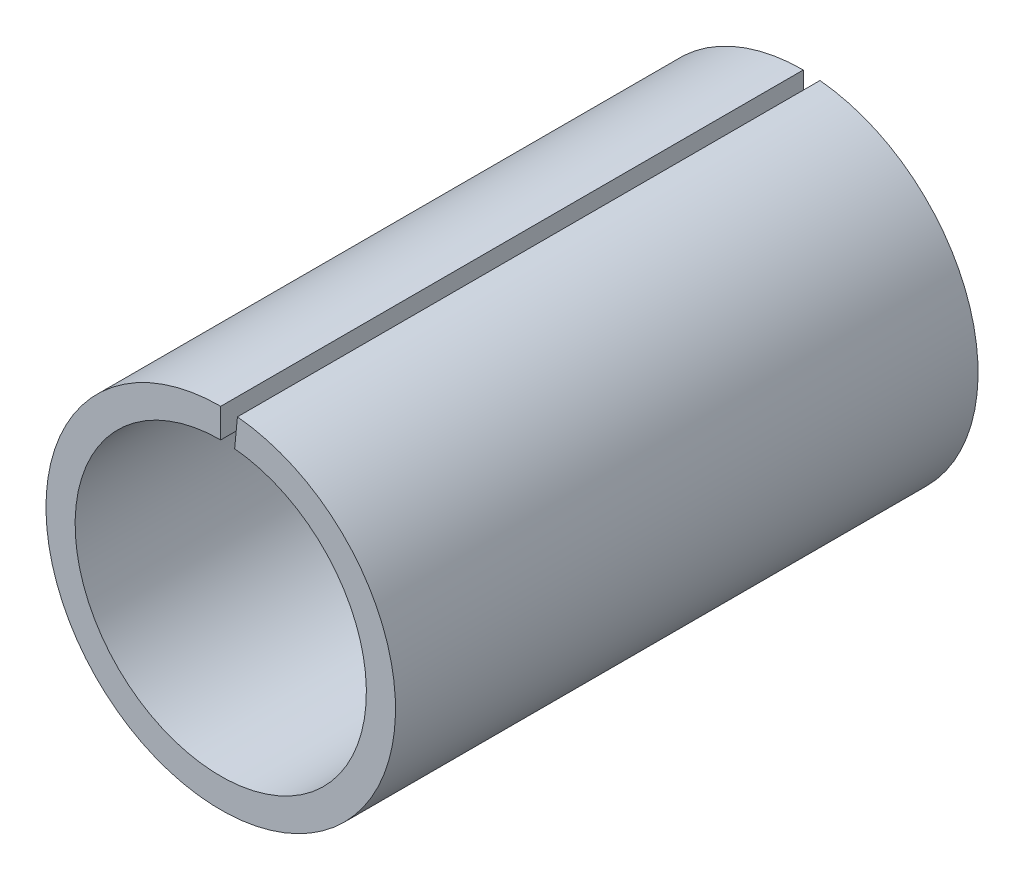
ISO-10303-21;
HEADER;
FILE_DESCRIPTION(('STEP AP214'),'2;1');
FILE_NAME('part.step','',(''),(''),'','','');
FILE_SCHEMA(('AUTOMOTIVE_DESIGN { 1 0 10303 214 1 1 1 1 }'));
ENDSEC;
DATA;
#1=APPLICATION_CONTEXT('core data for automotive mechanical design processes');
#2=APPLICATION_PROTOCOL_DEFINITION('international standard','automotive_design',2000,#1);
#3=PRODUCT_CONTEXT('',#1,'mechanical');
#4=PRODUCT('Part','Part','',(#3));
#5=PRODUCT_RELATED_PRODUCT_CATEGORY('part','',(#4));
#6=PRODUCT_DEFINITION_FORMATION('','',#4);
#7=PRODUCT_DEFINITION_CONTEXT('part definition',#1,'design');
#8=PRODUCT_DEFINITION('design','',#6,#7);
#9=PRODUCT_DEFINITION_SHAPE('','',#8);
#10=(LENGTH_UNIT() NAMED_UNIT(*) SI_UNIT(.MILLI.,.METRE.));
#11=(NAMED_UNIT(*) PLANE_ANGLE_UNIT() SI_UNIT($,.RADIAN.));
#12=(NAMED_UNIT(*) SI_UNIT($,.STERADIAN.) SOLID_ANGLE_UNIT());
#13=UNCERTAINTY_MEASURE_WITH_UNIT(LENGTH_MEASURE(1.E-05),#10,'distance_accuracy_value','');
#14=(GEOMETRIC_REPRESENTATION_CONTEXT(3) GLOBAL_UNCERTAINTY_ASSIGNED_CONTEXT((#13)) GLOBAL_UNIT_ASSIGNED_CONTEXT((#10,
#11,#12)) REPRESENTATION_CONTEXT('',''));
#15=CARTESIAN_POINT('',(0.,0.,0.));
#16=DIRECTION('',(0.,0.,1.));
#17=DIRECTION('',(1.,0.,0.));
#18=AXIS2_PLACEMENT_3D('',#15,#16,#17);
#19=CARTESIAN_POINT('',(0.,0.,20.));
#20=DIRECTION('',(0.,0.,1.));
#21=DIRECTION('',(1.,0.,0.));
#22=AXIS2_PLACEMENT_3D('',#19,#20,#21);
#23=PLANE('',#22);
#24=DIRECTION('',(0.095501543602488,0.99542928185258,0.));
#25=VECTOR('',#24,1.);
#26=CARTESIAN_POINT('',(0.,0.,20.));
#27=LINE('',#26,#25);
#28=CARTESIAN_POINT('',(0.47750771801244,4.9771464092629,20.));
#29=VERTEX_POINT('',#28);
#30=CARTESIAN_POINT('',(0.573009261614928,5.97257569111548,20.));
#31=VERTEX_POINT('',#30);
#32=EDGE_CURVE('E79',#29,#31,#27,.T.);
#33=ORIENTED_EDGE('',*,*,#32,.F.);
#34=CARTESIAN_POINT('',(0.,0.,20.));
#35=DIRECTION('',(0.,0.,1.));
#36=DIRECTION('',(1.,0.,0.));
#37=AXIS2_PLACEMENT_3D('',#34,#35,#36);
#38=CIRCLE('',#37,5.);
#39=CARTESIAN_POINT('',(0.,5.,20.));
#40=VERTEX_POINT('',#39);
#41=EDGE_CURVE('E88',#40,#29,#38,.T.);
#42=ORIENTED_EDGE('',*,*,#41,.F.);
#43=DIRECTION('',(0.,-1.,0.));
#44=VECTOR('',#43,1.);
#45=CARTESIAN_POINT('',(0.,0.,20.));
#46=LINE('',#45,#44);
#47=CARTESIAN_POINT('',(0.,6.,20.));
#48=VERTEX_POINT('',#47);
#49=EDGE_CURVE('E62',#48,#40,#46,.T.);
#50=ORIENTED_EDGE('',*,*,#49,.F.);
#51=CARTESIAN_POINT('',(0.,0.,20.));
#52=DIRECTION('',(0.,0.,1.));
#53=DIRECTION('',(1.,0.,0.));
#54=AXIS2_PLACEMENT_3D('',#51,#52,#53);
#55=CIRCLE('',#54,6.);
#56=EDGE_CURVE('E90',#48,#31,#55,.T.);
#57=ORIENTED_EDGE('',*,*,#56,.T.);
#58=EDGE_LOOP('',(#33,#42,#50,#57));
#59=FACE_BOUND('',#58,.T.);
#60=ADVANCED_FACE('F39',(#59),#23,.T.);
#61=CARTESIAN_POINT('',(0.,0.,0.));
#62=DIRECTION('',(0.,0.,1.));
#63=DIRECTION('',(1.,0.,0.));
#64=AXIS2_PLACEMENT_3D('',#61,#62,#63);
#65=PLANE('',#64);
#66=CARTESIAN_POINT('',(0.,0.,0.));
#67=DIRECTION('',(0.,0.,1.));
#68=DIRECTION('',(1.,0.,0.));
#69=AXIS2_PLACEMENT_3D('',#66,#67,#68);
#70=CIRCLE('',#69,5.);
#71=CARTESIAN_POINT('',(0.,5.,0.));
#72=VERTEX_POINT('',#71);
#73=CARTESIAN_POINT('',(0.47750771801244,4.9771464092629,0.));
#74=VERTEX_POINT('',#73);
#75=EDGE_CURVE('E96',#72,#74,#70,.T.);
#76=ORIENTED_EDGE('',*,*,#75,.T.);
#77=DIRECTION('',(0.095501543602488,0.99542928185258,0.));
#78=VECTOR('',#77,1.);
#79=CARTESIAN_POINT('',(0.,0.,0.));
#80=LINE('',#79,#78);
#81=CARTESIAN_POINT('',(0.573009261614928,5.97257569111548,0.));
#82=VERTEX_POINT('',#81);
#83=EDGE_CURVE('E54',#74,#82,#80,.T.);
#84=ORIENTED_EDGE('',*,*,#83,.T.);
#85=CARTESIAN_POINT('',(0.,0.,0.));
#86=DIRECTION('',(0.,0.,1.));
#87=DIRECTION('',(1.,0.,0.));
#88=AXIS2_PLACEMENT_3D('',#85,#86,#87);
#89=CIRCLE('',#88,6.);
#90=CARTESIAN_POINT('',(0.,6.,0.));
#91=VERTEX_POINT('',#90);
#92=EDGE_CURVE('E95',#91,#82,#89,.T.);
#93=ORIENTED_EDGE('',*,*,#92,.F.);
#94=DIRECTION('',(0.,-1.,0.));
#95=VECTOR('',#94,1.);
#96=CARTESIAN_POINT('',(0.,0.,0.));
#97=LINE('',#96,#95);
#98=EDGE_CURVE('E111',#91,#72,#97,.T.);
#99=ORIENTED_EDGE('',*,*,#98,.T.);
#100=EDGE_LOOP('',(#76,#84,#93,#99));
#101=FACE_BOUND('',#100,.T.);
#102=ADVANCED_FACE('F115',(#101),#65,.F.);
#103=CARTESIAN_POINT('',(0.,0.,20.));
#104=DIRECTION('',(0.,0.,-1.));
#105=DIRECTION('',(-1.,0.,0.));
#106=AXIS2_PLACEMENT_3D('',#103,#104,#105);
#107=CYLINDRICAL_SURFACE('',#106,6.);
#108=ORIENTED_EDGE('',*,*,#92,.T.);
#109=DIRECTION('',(0.,0.,-1.));
#110=VECTOR('',#109,1.);
#111=CARTESIAN_POINT('',(0.573009261614928,5.97257569111548,20.));
#112=LINE('',#111,#110);
#113=EDGE_CURVE('E102',#82,#31,#112,.F.);
#114=ORIENTED_EDGE('',*,*,#113,.T.);
#115=ORIENTED_EDGE('',*,*,#56,.F.);
#116=DIRECTION('',(0.,0.,-1.));
#117=VECTOR('',#116,1.);
#118=CARTESIAN_POINT('',(0.,6.,20.));
#119=LINE('',#118,#117);
#120=EDGE_CURVE('E117',#48,#91,#119,.T.);
#121=ORIENTED_EDGE('',*,*,#120,.T.);
#122=EDGE_LOOP('',(#108,#114,#115,#121));
#123=FACE_BOUND('',#122,.T.);
#124=ADVANCED_FACE('F41',(#123),#107,.T.);
#125=CARTESIAN_POINT('',(0.,0.,20.));
#126=DIRECTION('',(0.,0.,-1.));
#127=DIRECTION('',(-1.,0.,0.));
#128=AXIS2_PLACEMENT_3D('',#125,#126,#127);
#129=CYLINDRICAL_SURFACE('',#128,5.);
#130=DIRECTION('',(0.,0.,-1.));
#131=VECTOR('',#130,1.);
#132=CARTESIAN_POINT('',(0.47750771801244,4.9771464092629,20.));
#133=LINE('',#132,#131);
#134=EDGE_CURVE('E11',#74,#29,#133,.F.);
#135=ORIENTED_EDGE('',*,*,#134,.F.);
#136=ORIENTED_EDGE('',*,*,#75,.F.);
#137=DIRECTION('',(0.,0.,-1.));
#138=VECTOR('',#137,1.);
#139=CARTESIAN_POINT('',(0.,5.,20.));
#140=LINE('',#139,#138);
#141=EDGE_CURVE('E48',#40,#72,#140,.T.);
#142=ORIENTED_EDGE('',*,*,#141,.F.);
#143=ORIENTED_EDGE('',*,*,#41,.T.);
#144=EDGE_LOOP('',(#135,#136,#142,#143));
#145=FACE_BOUND('',#144,.T.);
#146=ADVANCED_FACE('F93',(#145),#129,.F.);
#147=CARTESIAN_POINT('',(0.,0.,-80.));
#148=DIRECTION('',(-1.,0.,0.));
#149=DIRECTION('',(0.,0.,1.));
#150=AXIS2_PLACEMENT_3D('',#147,#148,#149);
#151=PLANE('',#150);
#152=ORIENTED_EDGE('',*,*,#49,.T.);
#153=ORIENTED_EDGE('',*,*,#141,.T.);
#154=ORIENTED_EDGE('',*,*,#98,.F.);
#155=ORIENTED_EDGE('',*,*,#120,.F.);
#156=EDGE_LOOP('',(#152,#153,#154,#155));
#157=FACE_BOUND('',#156,.T.);
#158=ADVANCED_FACE('F110',(#157),#151,.F.);
#159=CARTESIAN_POINT('',(0.,0.,-80.));
#160=DIRECTION('',(0.99542928185258,-0.095501543602488,0.));
#161=DIRECTION('',(0.095501543602488,0.99542928185258,0.));
#162=AXIS2_PLACEMENT_3D('',#159,#160,#161);
#163=PLANE('',#162);
#164=ORIENTED_EDGE('',*,*,#83,.F.);
#165=ORIENTED_EDGE('',*,*,#134,.T.);
#166=ORIENTED_EDGE('',*,*,#32,.T.);
#167=ORIENTED_EDGE('',*,*,#113,.F.);
#168=EDGE_LOOP('',(#164,#165,#166,#167));
#169=FACE_BOUND('',#168,.T.);
#170=ADVANCED_FACE('F78',(#169),#163,.F.);
#171=CLOSED_SHELL('',(#60,#102,#124,#146,#158,#170));
#172=MANIFOLD_SOLID_BREP('B2',#171);
#173=ADVANCED_BREP_SHAPE_REPRESENTATION('',(#18,#172),#14);
#174=SHAPE_DEFINITION_REPRESENTATION(#9,#173);
ENDSEC;
END-ISO-10303-21;
